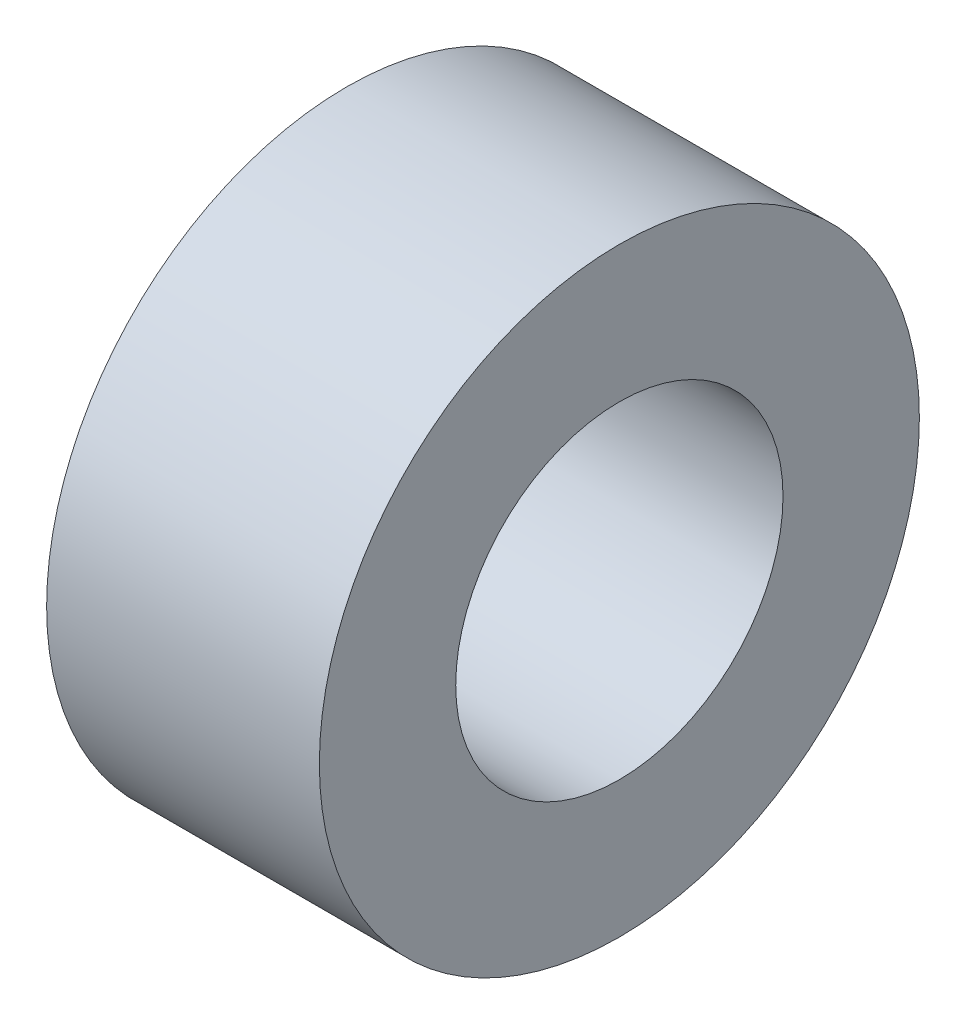
ISO-10303-21;
HEADER;
FILE_DESCRIPTION(('STEP AP214'),'2;1');
FILE_NAME('part.step','',(''),(''),'','','');
FILE_SCHEMA(('AUTOMOTIVE_DESIGN { 1 0 10303 214 1 1 1 1 }'));
ENDSEC;
DATA;
#1=APPLICATION_CONTEXT('core data for automotive mechanical design processes');
#2=APPLICATION_PROTOCOL_DEFINITION('international standard','automotive_design',2000,#1);
#3=PRODUCT_CONTEXT('',#1,'mechanical');
#4=PRODUCT('Part','Part','',(#3));
#5=PRODUCT_RELATED_PRODUCT_CATEGORY('part','',(#4));
#6=PRODUCT_DEFINITION_FORMATION('','',#4);
#7=PRODUCT_DEFINITION_CONTEXT('part definition',#1,'design');
#8=PRODUCT_DEFINITION('design','',#6,#7);
#9=PRODUCT_DEFINITION_SHAPE('','',#8);
#10=(LENGTH_UNIT() NAMED_UNIT(*) SI_UNIT(.MILLI.,.METRE.));
#11=(NAMED_UNIT(*) PLANE_ANGLE_UNIT() SI_UNIT($,.RADIAN.));
#12=(NAMED_UNIT(*) SI_UNIT($,.STERADIAN.) SOLID_ANGLE_UNIT());
#13=UNCERTAINTY_MEASURE_WITH_UNIT(LENGTH_MEASURE(1.E-05),#10,'distance_accuracy_value','');
#14=(GEOMETRIC_REPRESENTATION_CONTEXT(3) GLOBAL_UNCERTAINTY_ASSIGNED_CONTEXT((#13)) GLOBAL_UNIT_ASSIGNED_CONTEXT((#10,
#11,#12)) REPRESENTATION_CONTEXT('',''));
#15=CARTESIAN_POINT('',(0.,0.,0.));
#16=DIRECTION('',(0.,0.,1.));
#17=DIRECTION('',(1.,0.,0.));
#18=AXIS2_PLACEMENT_3D('',#15,#16,#17);
#19=CARTESIAN_POINT('',(5.,0.,0.));
#20=DIRECTION('',(1.,0.,0.));
#21=DIRECTION('',(0.,0.,-1.));
#22=AXIS2_PLACEMENT_3D('',#19,#20,#21);
#23=PLANE('',#22);
#24=CARTESIAN_POINT('',(5.,0.,0.));
#25=DIRECTION('',(1.,0.,0.));
#26=DIRECTION('',(0.,0.,-1.));
#27=AXIS2_PLACEMENT_3D('',#24,#25,#26);
#28=CIRCLE('',#27,5.5);
#29=CARTESIAN_POINT('',(5.,0.,-5.5));
#30=VERTEX_POINT('',#29);
#31=EDGE_CURVE('E10',#30,#30,#28,.T.);
#32=ORIENTED_EDGE('',*,*,#31,.T.);
#33=EDGE_LOOP('',(#32));
#34=FACE_BOUND('',#33,.T.);
#35=CARTESIAN_POINT('',(5.,0.,0.));
#36=DIRECTION('',(1.,0.,0.));
#37=DIRECTION('',(0.,0.,-1.));
#38=AXIS2_PLACEMENT_3D('',#35,#36,#37);
#39=CIRCLE('',#38,3.);
#40=CARTESIAN_POINT('',(5.,0.,-3.));
#41=VERTEX_POINT('',#40);
#42=EDGE_CURVE('E46',#41,#41,#39,.T.);
#43=ORIENTED_EDGE('',*,*,#42,.F.);
#44=EDGE_LOOP('',(#43));
#45=FACE_BOUND('',#44,.T.);
#46=ADVANCED_FACE('F35',(#34,#45),#23,.T.);
#47=CARTESIAN_POINT('',(0.,0.,0.));
#48=DIRECTION('',(1.,0.,0.));
#49=DIRECTION('',(0.,0.,-1.));
#50=AXIS2_PLACEMENT_3D('',#47,#48,#49);
#51=PLANE('',#50);
#52=CARTESIAN_POINT('',(0.,0.,0.));
#53=DIRECTION('',(1.,0.,0.));
#54=DIRECTION('',(0.,0.,-1.));
#55=AXIS2_PLACEMENT_3D('',#52,#53,#54);
#56=CIRCLE('',#55,5.5);
#57=CARTESIAN_POINT('',(0.,0.,-5.5));
#58=VERTEX_POINT('',#57);
#59=EDGE_CURVE('E39',#58,#58,#56,.T.);
#60=ORIENTED_EDGE('',*,*,#59,.F.);
#61=EDGE_LOOP('',(#60));
#62=FACE_BOUND('',#61,.T.);
#63=CARTESIAN_POINT('',(0.,0.,0.));
#64=DIRECTION('',(1.,0.,0.));
#65=DIRECTION('',(0.,0.,-1.));
#66=AXIS2_PLACEMENT_3D('',#63,#64,#65);
#67=CIRCLE('',#66,3.);
#68=CARTESIAN_POINT('',(0.,0.,-3.));
#69=VERTEX_POINT('',#68);
#70=EDGE_CURVE('E48',#69,#69,#67,.T.);
#71=ORIENTED_EDGE('',*,*,#70,.T.);
#72=EDGE_LOOP('',(#71));
#73=FACE_BOUND('',#72,.T.);
#74=ADVANCED_FACE('F58',(#62,#73),#51,.F.);
#75=CARTESIAN_POINT('',(5.,0.,0.));
#76=DIRECTION('',(-1.,0.,0.));
#77=DIRECTION('',(0.,0.,1.));
#78=AXIS2_PLACEMENT_3D('',#75,#76,#77);
#79=CYLINDRICAL_SURFACE('',#78,5.5);
#80=ORIENTED_EDGE('',*,*,#31,.F.);
#81=EDGE_LOOP('',(#80));
#82=FACE_BOUND('',#81,.T.);
#83=ORIENTED_EDGE('',*,*,#59,.T.);
#84=EDGE_LOOP('',(#83));
#85=FACE_BOUND('',#84,.T.);
#86=ADVANCED_FACE('F37',(#82,#85),#79,.T.);
#87=CARTESIAN_POINT('',(5.,0.,0.));
#88=DIRECTION('',(-1.,0.,0.));
#89=DIRECTION('',(0.,0.,1.));
#90=AXIS2_PLACEMENT_3D('',#87,#88,#89);
#91=CYLINDRICAL_SURFACE('',#90,3.);
#92=ORIENTED_EDGE('',*,*,#42,.T.);
#93=EDGE_LOOP('',(#92));
#94=FACE_BOUND('',#93,.T.);
#95=ORIENTED_EDGE('',*,*,#70,.F.);
#96=EDGE_LOOP('',(#95));
#97=FACE_BOUND('',#96,.T.);
#98=ADVANCED_FACE('F54',(#94,#97),#91,.F.);
#99=CLOSED_SHELL('',(#46,#74,#86,#98));
#100=MANIFOLD_SOLID_BREP('B2',#99);
#101=ADVANCED_BREP_SHAPE_REPRESENTATION('',(#18,#100),#14);
#102=SHAPE_DEFINITION_REPRESENTATION(#9,#101);
ENDSEC;
END-ISO-10303-21;
